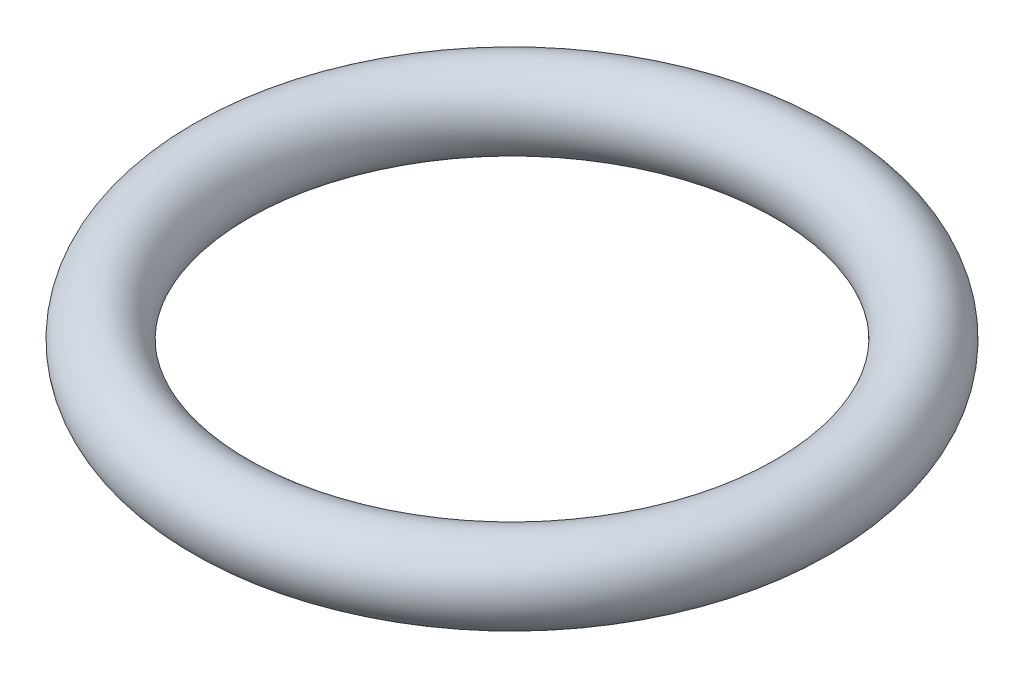
ISO-10303-21;
HEADER;
FILE_DESCRIPTION(('STEP AP214'),'2;1');
FILE_NAME('part.step','',(''),(''),'','','');
FILE_SCHEMA(('AUTOMOTIVE_DESIGN { 1 0 10303 214 1 1 1 1 }'));
ENDSEC;
DATA;
#1=APPLICATION_CONTEXT('core data for automotive mechanical design processes');
#2=APPLICATION_PROTOCOL_DEFINITION('international standard','automotive_design',2000,#1);
#3=PRODUCT_CONTEXT('',#1,'mechanical');
#4=PRODUCT('Part','Part','',(#3));
#5=PRODUCT_RELATED_PRODUCT_CATEGORY('part','',(#4));
#6=PRODUCT_DEFINITION_FORMATION('','',#4);
#7=PRODUCT_DEFINITION_CONTEXT('part definition',#1,'design');
#8=PRODUCT_DEFINITION('design','',#6,#7);
#9=PRODUCT_DEFINITION_SHAPE('','',#8);
#10=(LENGTH_UNIT() NAMED_UNIT(*) SI_UNIT(.MILLI.,.METRE.));
#11=(NAMED_UNIT(*) PLANE_ANGLE_UNIT() SI_UNIT($,.RADIAN.));
#12=(NAMED_UNIT(*) SI_UNIT($,.STERADIAN.) SOLID_ANGLE_UNIT());
#13=UNCERTAINTY_MEASURE_WITH_UNIT(LENGTH_MEASURE(1.E-05),#10,'distance_accuracy_value','');
#14=(GEOMETRIC_REPRESENTATION_CONTEXT(3) GLOBAL_UNCERTAINTY_ASSIGNED_CONTEXT((#13)) GLOBAL_UNIT_ASSIGNED_CONTEXT((#10,
#11,#12)) REPRESENTATION_CONTEXT('',''));
#15=CARTESIAN_POINT('',(0.,0.,0.));
#16=DIRECTION('',(0.,0.,1.));
#17=DIRECTION('',(1.,0.,0.));
#18=AXIS2_PLACEMENT_3D('',#15,#16,#17);
#19=CARTESIAN_POINT('',(0.,0.,0.));
#20=DIRECTION('',(0.,1.,0.));
#21=DIRECTION('',(-1.,0.,0.));
#22=AXIS2_PLACEMENT_3D('',#19,#20,#21);
#23=TOROIDAL_SURFACE('',#22,9.0932,1.2065);
#24=CARTESIAN_POINT('',(-10.2997,0.,0.));
#25=VERTEX_POINT('',#24);
#26=VERTEX_LOOP('',#25);
#27=FACE_BOUND('',#26,.T.);
#28=ADVANCED_FACE('F37',(#27),#23,.T.);
#29=CLOSED_SHELL('',(#28));
#30=MANIFOLD_SOLID_BREP('B2',#29);
#31=ADVANCED_BREP_SHAPE_REPRESENTATION('',(#18,#30),#14);
#32=SHAPE_DEFINITION_REPRESENTATION(#9,#31);
ENDSEC;
END-ISO-10303-21;
